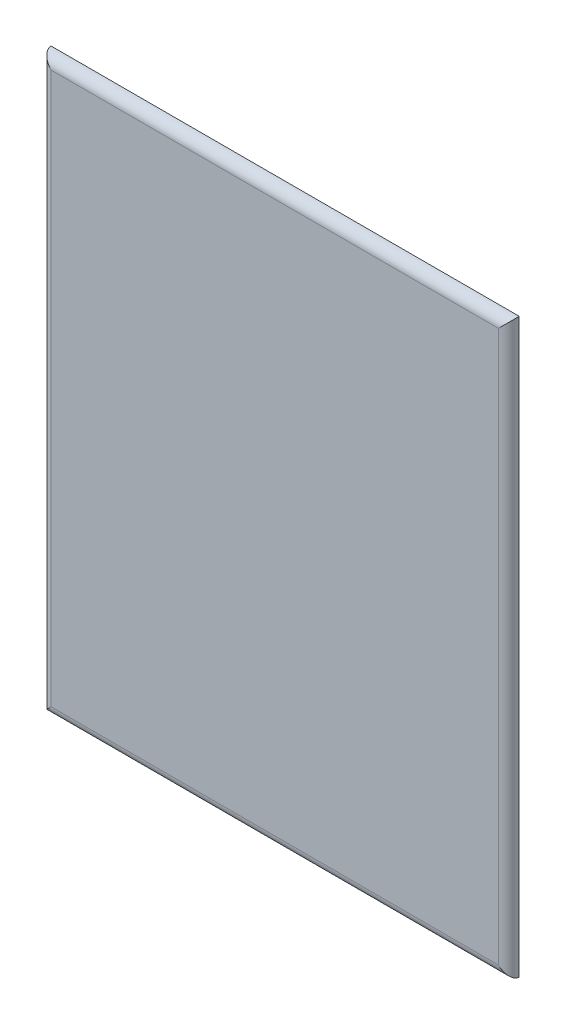
ISO-10303-21;
HEADER;
FILE_DESCRIPTION(('STEP AP214'),'2;1');
FILE_NAME('part.step','',(''),(''),'','','');
FILE_SCHEMA(('AUTOMOTIVE_DESIGN { 1 0 10303 214 1 1 1 1 }'));
ENDSEC;
DATA;
#1=APPLICATION_CONTEXT('core data for automotive mechanical design processes');
#2=APPLICATION_PROTOCOL_DEFINITION('international standard','automotive_design',2000,#1);
#3=PRODUCT_CONTEXT('',#1,'mechanical');
#4=PRODUCT('Part','Part','',(#3));
#5=PRODUCT_RELATED_PRODUCT_CATEGORY('part','',(#4));
#6=PRODUCT_DEFINITION_FORMATION('','',#4);
#7=PRODUCT_DEFINITION_CONTEXT('part definition',#1,'design');
#8=PRODUCT_DEFINITION('design','',#6,#7);
#9=PRODUCT_DEFINITION_SHAPE('','',#8);
#10=(LENGTH_UNIT() NAMED_UNIT(*) SI_UNIT(.MILLI.,.METRE.));
#11=(NAMED_UNIT(*) PLANE_ANGLE_UNIT() SI_UNIT($,.RADIAN.));
#12=(NAMED_UNIT(*) SI_UNIT($,.STERADIAN.) SOLID_ANGLE_UNIT());
#13=UNCERTAINTY_MEASURE_WITH_UNIT(LENGTH_MEASURE(1.E-05),#10,'distance_accuracy_value','');
#14=(GEOMETRIC_REPRESENTATION_CONTEXT(3) GLOBAL_UNCERTAINTY_ASSIGNED_CONTEXT((#13)) GLOBAL_UNIT_ASSIGNED_CONTEXT((#10,
#11,#12)) REPRESENTATION_CONTEXT('',''));
#15=CARTESIAN_POINT('',(0.,0.,0.));
#16=DIRECTION('',(0.,0.,1.));
#17=DIRECTION('',(1.,0.,0.));
#18=AXIS2_PLACEMENT_3D('',#15,#16,#17);
#19=CARTESIAN_POINT('',(0.,0.,3.));
#20=DIRECTION('',(0.,0.,-1.));
#21=DIRECTION('',(-1.,0.,0.));
#22=AXIS2_PLACEMENT_3D('',#19,#20,#21);
#23=PLANE('',#22);
#24=DIRECTION('',(1.,0.,0.));
#25=VECTOR('',#24,1.);
#26=CARTESIAN_POINT('',(0.,-79.5,3.));
#27=LINE('',#26,#25);
#28=CARTESIAN_POINT('',(-64.5,-79.5,3.));
#29=VERTEX_POINT('',#28);
#30=CARTESIAN_POINT('',(64.5,-79.5,3.));
#31=VERTEX_POINT('',#30);
#32=EDGE_CURVE('E229',#29,#31,#27,.T.);
#33=ORIENTED_EDGE('',*,*,#32,.T.);
#34=DIRECTION('',(0.,1.,0.));
#35=VECTOR('',#34,1.);
#36=CARTESIAN_POINT('',(64.5,0.,3.));
#37=LINE('',#36,#35);
#38=CARTESIAN_POINT('',(64.5,79.5,3.));
#39=VERTEX_POINT('',#38);
#40=EDGE_CURVE('E232',#31,#39,#37,.T.);
#41=ORIENTED_EDGE('',*,*,#40,.T.);
#42=DIRECTION('',(-1.,0.,0.));
#43=VECTOR('',#42,1.);
#44=CARTESIAN_POINT('',(0.,79.5,3.));
#45=LINE('',#44,#43);
#46=CARTESIAN_POINT('',(-64.5,79.5,3.));
#47=VERTEX_POINT('',#46);
#48=EDGE_CURVE('E227',#39,#47,#45,.T.);
#49=ORIENTED_EDGE('',*,*,#48,.T.);
#50=DIRECTION('',(0.,-1.,0.));
#51=VECTOR('',#50,1.);
#52=CARTESIAN_POINT('',(-64.5,0.,3.));
#53=LINE('',#52,#51);
#54=EDGE_CURVE('E225',#47,#29,#53,.T.);
#55=ORIENTED_EDGE('',*,*,#54,.T.);
#56=EDGE_LOOP('',(#33,#41,#49,#55));
#57=FACE_BOUND('',#56,.T.);
#58=ADVANCED_FACE('F41',(#57),#23,.F.);
#59=CARTESIAN_POINT('',(0.,0.,0.));
#60=DIRECTION('',(0.,0.,-1.));
#61=DIRECTION('',(-1.,0.,0.));
#62=AXIS2_PLACEMENT_3D('',#59,#60,#61);
#63=PLANE('',#62);
#64=CARTESIAN_POINT('',(14.5,-14.5,0.));
#65=DIRECTION('',(0.,0.,-1.));
#66=DIRECTION('',(1.,0.,0.));
#67=AXIS2_PLACEMENT_3D('',#64,#65,#66);
#68=CIRCLE('',#67,2.);
#69=CARTESIAN_POINT('',(16.5,-14.5,0.));
#70=VERTEX_POINT('',#69);
#71=CARTESIAN_POINT('',(14.5,-16.5,0.));
#72=VERTEX_POINT('',#71);
#73=EDGE_CURVE('E175',#70,#72,#68,.T.);
#74=ORIENTED_EDGE('',*,*,#73,.F.);
#75=DIRECTION('',(0.,-1.,0.));
#76=VECTOR('',#75,1.);
#77=CARTESIAN_POINT('',(16.5,-14.5,0.));
#78=LINE('',#77,#76);
#79=CARTESIAN_POINT('',(16.5,14.5,0.));
#80=VERTEX_POINT('',#79);
#81=EDGE_CURVE('E193',#80,#70,#78,.T.);
#82=ORIENTED_EDGE('',*,*,#81,.F.);
#83=CARTESIAN_POINT('',(14.5,14.5,0.));
#84=DIRECTION('',(0.,0.,-1.));
#85=DIRECTION('',(1.,0.,0.));
#86=AXIS2_PLACEMENT_3D('',#83,#84,#85);
#87=CIRCLE('',#86,2.);
#88=CARTESIAN_POINT('',(14.5,16.5,0.));
#89=VERTEX_POINT('',#88);
#90=EDGE_CURVE('E189',#89,#80,#87,.T.);
#91=ORIENTED_EDGE('',*,*,#90,.F.);
#92=DIRECTION('',(1.,0.,0.));
#93=VECTOR('',#92,1.);
#94=CARTESIAN_POINT('',(14.5,16.5,0.));
#95=LINE('',#94,#93);
#96=CARTESIAN_POINT('',(-14.5,16.5,0.));
#97=VERTEX_POINT('',#96);
#98=EDGE_CURVE('E185',#97,#89,#95,.T.);
#99=ORIENTED_EDGE('',*,*,#98,.F.);
#100=CARTESIAN_POINT('',(-14.5,14.5,0.));
#101=DIRECTION('',(0.,0.,-1.));
#102=DIRECTION('',(1.,0.,0.));
#103=AXIS2_PLACEMENT_3D('',#100,#101,#102);
#104=CIRCLE('',#103,2.);
#105=CARTESIAN_POINT('',(-16.5,14.5,0.));
#106=VERTEX_POINT('',#105);
#107=EDGE_CURVE('E182',#106,#97,#104,.T.);
#108=ORIENTED_EDGE('',*,*,#107,.F.);
#109=DIRECTION('',(0.,1.,0.));
#110=VECTOR('',#109,1.);
#111=CARTESIAN_POINT('',(-16.5,-14.5,0.));
#112=LINE('',#111,#110);
#113=CARTESIAN_POINT('',(-16.5,-14.5,0.));
#114=VERTEX_POINT('',#113);
#115=EDGE_CURVE('E171',#114,#106,#112,.T.);
#116=ORIENTED_EDGE('',*,*,#115,.F.);
#117=CARTESIAN_POINT('',(-14.5,-14.5,0.));
#118=DIRECTION('',(0.,0.,-1.));
#119=DIRECTION('',(-1.,0.,0.));
#120=AXIS2_PLACEMENT_3D('',#117,#118,#119);
#121=CIRCLE('',#120,2.);
#122=CARTESIAN_POINT('',(-14.5,-16.5,0.));
#123=VERTEX_POINT('',#122);
#124=EDGE_CURVE('E152',#123,#114,#121,.T.);
#125=ORIENTED_EDGE('',*,*,#124,.F.);
#126=DIRECTION('',(-1.,0.,0.));
#127=VECTOR('',#126,1.);
#128=CARTESIAN_POINT('',(14.5,-16.5,0.));
#129=LINE('',#128,#127);
#130=EDGE_CURVE('E167',#72,#123,#129,.T.);
#131=ORIENTED_EDGE('',*,*,#130,.F.);
#132=EDGE_LOOP('',(#74,#82,#91,#99,#108,#116,#125,#131));
#133=FACE_BOUND('',#132,.T.);
#134=DIRECTION('',(0.,1.,0.));
#135=VECTOR('',#134,1.);
#136=CARTESIAN_POINT('',(67.5,-82.5,0.));
#137=LINE('',#136,#135);
#138=CARTESIAN_POINT('',(67.5,-82.5,0.));
#139=VERTEX_POINT('',#138);
#140=CARTESIAN_POINT('',(67.5,82.5,0.));
#141=VERTEX_POINT('',#140);
#142=EDGE_CURVE('E212',#139,#141,#137,.T.);
#143=ORIENTED_EDGE('',*,*,#142,.F.);
#144=DIRECTION('',(1.,0.,0.));
#145=VECTOR('',#144,1.);
#146=CARTESIAN_POINT('',(-67.5,-82.5,0.));
#147=LINE('',#146,#145);
#148=CARTESIAN_POINT('',(-67.5,-82.5,0.));
#149=VERTEX_POINT('',#148);
#150=EDGE_CURVE('E222',#149,#139,#147,.T.);
#151=ORIENTED_EDGE('',*,*,#150,.F.);
#152=DIRECTION('',(0.,-1.,0.));
#153=VECTOR('',#152,1.);
#154=CARTESIAN_POINT('',(-67.5,-82.5,0.));
#155=LINE('',#154,#153);
#156=CARTESIAN_POINT('',(-67.5,82.5,0.));
#157=VERTEX_POINT('',#156);
#158=EDGE_CURVE('E219',#157,#149,#155,.T.);
#159=ORIENTED_EDGE('',*,*,#158,.F.);
#160=DIRECTION('',(-1.,0.,0.));
#161=VECTOR('',#160,1.);
#162=CARTESIAN_POINT('',(-67.5,82.5,0.));
#163=LINE('',#162,#161);
#164=EDGE_CURVE('E215',#141,#157,#163,.T.);
#165=ORIENTED_EDGE('',*,*,#164,.F.);
#166=EDGE_LOOP('',(#143,#151,#159,#165));
#167=FACE_BOUND('',#166,.T.);
#168=ADVANCED_FACE('F165',(#133,#167),#63,.T.);
#169=CARTESIAN_POINT('',(0.,79.5,0.));
#170=DIRECTION('',(-1.,0.,0.));
#171=DIRECTION('',(0.,0.,1.));
#172=AXIS2_PLACEMENT_3D('',#169,#170,#171);
#173=CYLINDRICAL_SURFACE('',#172,3.);
#174=CARTESIAN_POINT('',(64.5,79.5,0.));
#175=DIRECTION('',(-0.707106781186547,0.707106781186547,0.));
#176=DIRECTION('',(0.707106781186547,0.707106781186547,0.));
#177=AXIS2_PLACEMENT_3D('',#174,#175,#176);
#178=ELLIPSE('',#177,4.24264068711928,3.);
#179=EDGE_CURVE('E238',#141,#39,#178,.F.);
#180=ORIENTED_EDGE('',*,*,#179,.F.);
#181=ORIENTED_EDGE('',*,*,#164,.T.);
#182=CARTESIAN_POINT('',(-64.5,79.5,0.));
#183=DIRECTION('',(-0.707106781186547,-0.707106781186547,0.));
#184=DIRECTION('',(0.707106781186547,-0.707106781186547,0.));
#185=AXIS2_PLACEMENT_3D('',#182,#183,#184);
#186=ELLIPSE('',#185,4.24264068711928,3.);
#187=EDGE_CURVE('E216',#47,#157,#186,.T.);
#188=ORIENTED_EDGE('',*,*,#187,.F.);
#189=ORIENTED_EDGE('',*,*,#48,.F.);
#190=EDGE_LOOP('',(#180,#181,#188,#189));
#191=FACE_BOUND('',#190,.T.);
#192=ADVANCED_FACE('F344',(#191),#173,.T.);
#193=CARTESIAN_POINT('',(-64.5,0.,0.));
#194=DIRECTION('',(0.,-1.,0.));
#195=DIRECTION('',(0.,0.,-1.));
#196=AXIS2_PLACEMENT_3D('',#193,#194,#195);
#197=CYLINDRICAL_SURFACE('',#196,3.);
#198=ORIENTED_EDGE('',*,*,#187,.T.);
#199=ORIENTED_EDGE('',*,*,#158,.T.);
#200=CARTESIAN_POINT('',(-64.5,-79.5,0.));
#201=DIRECTION('',(0.707106781186547,-0.707106781186547,0.));
#202=DIRECTION('',(-0.707106781186547,-0.707106781186547,0.));
#203=AXIS2_PLACEMENT_3D('',#200,#201,#202);
#204=ELLIPSE('',#203,4.24264068711928,3.);
#205=EDGE_CURVE('E236',#29,#149,#204,.T.);
#206=ORIENTED_EDGE('',*,*,#205,.F.);
#207=ORIENTED_EDGE('',*,*,#54,.F.);
#208=EDGE_LOOP('',(#198,#199,#206,#207));
#209=FACE_BOUND('',#208,.T.);
#210=ADVANCED_FACE('F357',(#209),#197,.T.);
#211=CARTESIAN_POINT('',(64.5,0.,0.));
#212=DIRECTION('',(0.,1.,0.));
#213=DIRECTION('',(0.,0.,1.));
#214=AXIS2_PLACEMENT_3D('',#211,#212,#213);
#215=CYLINDRICAL_SURFACE('',#214,3.);
#216=ORIENTED_EDGE('',*,*,#179,.T.);
#217=ORIENTED_EDGE('',*,*,#40,.F.);
#218=CARTESIAN_POINT('',(64.5,-79.5,0.));
#219=DIRECTION('',(0.707106781186547,0.707106781186547,0.));
#220=DIRECTION('',(-0.707106781186547,0.707106781186547,0.));
#221=AXIS2_PLACEMENT_3D('',#218,#219,#220);
#222=ELLIPSE('',#221,4.24264068711928,3.);
#223=EDGE_CURVE('E211',#139,#31,#222,.F.);
#224=ORIENTED_EDGE('',*,*,#223,.F.);
#225=ORIENTED_EDGE('',*,*,#142,.T.);
#226=EDGE_LOOP('',(#216,#217,#224,#225));
#227=FACE_BOUND('',#226,.T.);
#228=ADVANCED_FACE('F353',(#227),#215,.T.);
#229=CARTESIAN_POINT('',(0.,-79.5,0.));
#230=DIRECTION('',(1.,0.,0.));
#231=DIRECTION('',(0.,0.,-1.));
#232=AXIS2_PLACEMENT_3D('',#229,#230,#231);
#233=CYLINDRICAL_SURFACE('',#232,3.);
#234=ORIENTED_EDGE('',*,*,#205,.T.);
#235=ORIENTED_EDGE('',*,*,#150,.T.);
#236=ORIENTED_EDGE('',*,*,#223,.T.);
#237=ORIENTED_EDGE('',*,*,#32,.F.);
#238=EDGE_LOOP('',(#234,#235,#236,#237));
#239=FACE_BOUND('',#238,.T.);
#240=ADVANCED_FACE('F350',(#239),#233,.T.);
#241=CARTESIAN_POINT('',(14.5,-14.5,-5.));
#242=DIRECTION('',(0.,0.,1.));
#243=DIRECTION('',(1.,0.,0.));
#244=AXIS2_PLACEMENT_3D('',#241,#242,#243);
#245=CYLINDRICAL_SURFACE('',#244,2.);
#246=DIRECTION('',(0.,0.,1.));
#247=VECTOR('',#246,1.);
#248=CARTESIAN_POINT('',(14.5,-16.5,-5.));
#249=LINE('',#248,#247);
#250=CARTESIAN_POINT('',(14.5,-16.5,-3.));
#251=VERTEX_POINT('',#250);
#252=EDGE_CURVE('E158',#251,#72,#249,.T.);
#253=ORIENTED_EDGE('',*,*,#252,.F.);
#254=CARTESIAN_POINT('',(14.5,-14.5,-3.));
#255=DIRECTION('',(0.,0.,1.));
#256=DIRECTION('',(1.,0.,0.));
#257=AXIS2_PLACEMENT_3D('',#254,#255,#256);
#258=CIRCLE('',#257,2.);
#259=CARTESIAN_POINT('',(16.5,-14.5,-3.));
#260=VERTEX_POINT('',#259);
#261=EDGE_CURVE('E259',#251,#260,#258,.T.);
#262=ORIENTED_EDGE('',*,*,#261,.T.);
#263=DIRECTION('',(0.,0.,1.));
#264=VECTOR('',#263,1.);
#265=CARTESIAN_POINT('',(16.5,-14.5,-5.));
#266=LINE('',#265,#264);
#267=EDGE_CURVE('E197',#260,#70,#266,.T.);
#268=ORIENTED_EDGE('',*,*,#267,.T.);
#269=ORIENTED_EDGE('',*,*,#73,.T.);
#270=EDGE_LOOP('',(#253,#262,#268,#269));
#271=FACE_BOUND('',#270,.T.);
#272=ADVANCED_FACE('F347',(#271),#245,.T.);
#273=CARTESIAN_POINT('',(14.5,-16.5,-5.));
#274=DIRECTION('',(0.,1.,0.));
#275=DIRECTION('',(0.,0.,1.));
#276=AXIS2_PLACEMENT_3D('',#273,#274,#275);
#277=PLANE('',#276);
#278=DIRECTION('',(0.,0.,1.));
#279=VECTOR('',#278,1.);
#280=CARTESIAN_POINT('',(-14.5,-16.5,-5.));
#281=LINE('',#280,#279);
#282=CARTESIAN_POINT('',(-14.5,-16.5,-3.));
#283=VERTEX_POINT('',#282);
#284=EDGE_CURVE('E148',#283,#123,#281,.T.);
#285=ORIENTED_EDGE('',*,*,#284,.F.);
#286=DIRECTION('',(-1.,0.,0.));
#287=VECTOR('',#286,1.);
#288=CARTESIAN_POINT('',(14.5,-16.5,-3.));
#289=LINE('',#288,#287);
#290=EDGE_CURVE('E257',#283,#251,#289,.F.);
#291=ORIENTED_EDGE('',*,*,#290,.T.);
#292=ORIENTED_EDGE('',*,*,#252,.T.);
#293=ORIENTED_EDGE('',*,*,#130,.T.);
#294=EDGE_LOOP('',(#285,#291,#292,#293));
#295=FACE_BOUND('',#294,.T.);
#296=ADVANCED_FACE('F173',(#295),#277,.F.);
#297=CARTESIAN_POINT('',(-14.5,-14.5,-5.));
#298=DIRECTION('',(0.,0.,1.));
#299=DIRECTION('',(1.,0.,0.));
#300=AXIS2_PLACEMENT_3D('',#297,#298,#299);
#301=CYLINDRICAL_SURFACE('',#300,2.);
#302=DIRECTION('',(0.,0.,1.));
#303=VECTOR('',#302,1.);
#304=CARTESIAN_POINT('',(-16.5,-14.5,-5.));
#305=LINE('',#304,#303);
#306=CARTESIAN_POINT('',(-16.5,-14.5,-3.));
#307=VERTEX_POINT('',#306);
#308=EDGE_CURVE('E159',#307,#114,#305,.T.);
#309=ORIENTED_EDGE('',*,*,#308,.F.);
#310=CARTESIAN_POINT('',(-14.5,-14.5,-3.));
#311=DIRECTION('',(0.,0.,1.));
#312=DIRECTION('',(1.,0.,0.));
#313=AXIS2_PLACEMENT_3D('',#310,#311,#312);
#314=CIRCLE('',#313,2.);
#315=EDGE_CURVE('E154',#307,#283,#314,.T.);
#316=ORIENTED_EDGE('',*,*,#315,.T.);
#317=ORIENTED_EDGE('',*,*,#284,.T.);
#318=ORIENTED_EDGE('',*,*,#124,.T.);
#319=EDGE_LOOP('',(#309,#316,#317,#318));
#320=FACE_BOUND('',#319,.T.);
#321=ADVANCED_FACE('F151',(#320),#301,.T.);
#322=CARTESIAN_POINT('',(-16.5,-14.5,-5.));
#323=DIRECTION('',(1.,0.,0.));
#324=DIRECTION('',(0.,0.,-1.));
#325=AXIS2_PLACEMENT_3D('',#322,#323,#324);
#326=PLANE('',#325);
#327=CARTESIAN_POINT('',(-16.5,0.,-1.5));
#328=DIRECTION('',(1.,0.,0.));
#329=DIRECTION('',(0.,0.,-1.));
#330=AXIS2_PLACEMENT_3D('',#327,#328,#329);
#331=CIRCLE('',#330,0.75);
#332=CARTESIAN_POINT('',(-16.5,0.,-2.25));
#333=VERTEX_POINT('',#332);
#334=EDGE_CURVE('E11',#333,#333,#331,.F.);
#335=ORIENTED_EDGE('',*,*,#334,.F.);
#336=EDGE_LOOP('',(#335));
#337=FACE_BOUND('',#336,.T.);
#338=DIRECTION('',(0.,0.,1.));
#339=VECTOR('',#338,1.);
#340=CARTESIAN_POINT('',(-16.5,14.5,-5.));
#341=LINE('',#340,#339);
#342=CARTESIAN_POINT('',(-16.5,14.5,-3.));
#343=VERTEX_POINT('',#342);
#344=EDGE_CURVE('E207',#343,#106,#341,.T.);
#345=ORIENTED_EDGE('',*,*,#344,.F.);
#346=DIRECTION('',(0.,1.,0.));
#347=VECTOR('',#346,1.);
#348=CARTESIAN_POINT('',(-16.5,-14.5,-3.));
#349=LINE('',#348,#347);
#350=EDGE_CURVE('E253',#343,#307,#349,.F.);
#351=ORIENTED_EDGE('',*,*,#350,.T.);
#352=ORIENTED_EDGE('',*,*,#308,.T.);
#353=ORIENTED_EDGE('',*,*,#115,.T.);
#354=EDGE_LOOP('',(#345,#351,#352,#353));
#355=FACE_BOUND('',#354,.T.);
#356=ADVANCED_FACE('F327',(#337,#355),#326,.F.);
#357=CARTESIAN_POINT('',(-14.5,14.5,-5.));
#358=DIRECTION('',(0.,0.,1.));
#359=DIRECTION('',(1.,0.,0.));
#360=AXIS2_PLACEMENT_3D('',#357,#358,#359);
#361=CYLINDRICAL_SURFACE('',#360,2.);
#362=DIRECTION('',(0.,0.,1.));
#363=VECTOR('',#362,1.);
#364=CARTESIAN_POINT('',(-14.5,16.5,-5.));
#365=LINE('',#364,#363);
#366=CARTESIAN_POINT('',(-14.5,16.5,-3.));
#367=VERTEX_POINT('',#366);
#368=EDGE_CURVE('E205',#367,#97,#365,.T.);
#369=ORIENTED_EDGE('',*,*,#368,.F.);
#370=CARTESIAN_POINT('',(-14.5,14.5,-3.));
#371=DIRECTION('',(0.,0.,1.));
#372=DIRECTION('',(1.,0.,0.));
#373=AXIS2_PLACEMENT_3D('',#370,#371,#372);
#374=CIRCLE('',#373,2.);
#375=EDGE_CURVE('E49',#367,#343,#374,.T.);
#376=ORIENTED_EDGE('',*,*,#375,.T.);
#377=ORIENTED_EDGE('',*,*,#344,.T.);
#378=ORIENTED_EDGE('',*,*,#107,.T.);
#379=EDGE_LOOP('',(#369,#376,#377,#378));
#380=FACE_BOUND('',#379,.T.);
#381=ADVANCED_FACE('F312',(#380),#361,.T.);
#382=CARTESIAN_POINT('',(14.5,16.5,-5.));
#383=DIRECTION('',(0.,-1.,0.));
#384=DIRECTION('',(0.,0.,-1.));
#385=AXIS2_PLACEMENT_3D('',#382,#383,#384);
#386=PLANE('',#385);
#387=DIRECTION('',(0.,0.,1.));
#388=VECTOR('',#387,1.);
#389=CARTESIAN_POINT('',(14.5,16.5,-5.));
#390=LINE('',#389,#388);
#391=CARTESIAN_POINT('',(14.5,16.5,-3.));
#392=VERTEX_POINT('',#391);
#393=EDGE_CURVE('E202',#392,#89,#390,.T.);
#394=ORIENTED_EDGE('',*,*,#393,.F.);
#395=DIRECTION('',(1.,0.,0.));
#396=VECTOR('',#395,1.);
#397=CARTESIAN_POINT('',(14.5,16.5,-3.));
#398=LINE('',#397,#396);
#399=EDGE_CURVE('E56',#392,#367,#398,.F.);
#400=ORIENTED_EDGE('',*,*,#399,.T.);
#401=ORIENTED_EDGE('',*,*,#368,.T.);
#402=ORIENTED_EDGE('',*,*,#98,.T.);
#403=EDGE_LOOP('',(#394,#400,#401,#402));
#404=FACE_BOUND('',#403,.T.);
#405=ADVANCED_FACE('F308',(#404),#386,.F.);
#406=CARTESIAN_POINT('',(14.5,14.5,-5.));
#407=DIRECTION('',(0.,0.,1.));
#408=DIRECTION('',(1.,0.,0.));
#409=AXIS2_PLACEMENT_3D('',#406,#407,#408);
#410=CYLINDRICAL_SURFACE('',#409,2.);
#411=DIRECTION('',(0.,0.,1.));
#412=VECTOR('',#411,1.);
#413=CARTESIAN_POINT('',(16.5,14.5,-5.));
#414=LINE('',#413,#412);
#415=CARTESIAN_POINT('',(16.5,14.5,-3.));
#416=VERTEX_POINT('',#415);
#417=EDGE_CURVE('E199',#416,#80,#414,.T.);
#418=ORIENTED_EDGE('',*,*,#417,.F.);
#419=CARTESIAN_POINT('',(14.5,14.5,-3.));
#420=DIRECTION('',(0.,0.,1.));
#421=DIRECTION('',(1.,0.,0.));
#422=AXIS2_PLACEMENT_3D('',#419,#420,#421);
#423=CIRCLE('',#422,2.);
#424=EDGE_CURVE('E67',#416,#392,#423,.T.);
#425=ORIENTED_EDGE('',*,*,#424,.T.);
#426=ORIENTED_EDGE('',*,*,#393,.T.);
#427=ORIENTED_EDGE('',*,*,#90,.T.);
#428=EDGE_LOOP('',(#418,#425,#426,#427));
#429=FACE_BOUND('',#428,.T.);
#430=ADVANCED_FACE('F305',(#429),#410,.T.);
#431=CARTESIAN_POINT('',(16.5,-14.5,-5.));
#432=DIRECTION('',(-1.,0.,0.));
#433=DIRECTION('',(0.,0.,1.));
#434=AXIS2_PLACEMENT_3D('',#431,#432,#433);
#435=PLANE('',#434);
#436=ORIENTED_EDGE('',*,*,#267,.F.);
#437=DIRECTION('',(0.,-1.,0.));
#438=VECTOR('',#437,1.);
#439=CARTESIAN_POINT('',(16.5,-14.5,-3.));
#440=LINE('',#439,#438);
#441=EDGE_CURVE('E261',#260,#416,#440,.F.);
#442=ORIENTED_EDGE('',*,*,#441,.T.);
#443=ORIENTED_EDGE('',*,*,#417,.T.);
#444=ORIENTED_EDGE('',*,*,#81,.T.);
#445=EDGE_LOOP('',(#436,#442,#443,#444));
#446=FACE_BOUND('',#445,.T.);
#447=ADVANCED_FACE('F303',(#446),#435,.F.);
#448=CARTESIAN_POINT('',(14.5,-14.5,-5.));
#449=DIRECTION('',(0.,0.,1.));
#450=DIRECTION('',(1.,0.,0.));
#451=AXIS2_PLACEMENT_3D('',#448,#449,#450);
#452=PLANE('',#451);
#453=DIRECTION('',(-1.,0.,0.));
#454=VECTOR('',#453,1.);
#455=CARTESIAN_POINT('',(14.5,-14.5,-5.));
#456=LINE('',#455,#454);
#457=CARTESIAN_POINT('',(14.5,-14.5,-5.));
#458=VERTEX_POINT('',#457);
#459=CARTESIAN_POINT('',(-14.5,-14.5,-5.));
#460=VERTEX_POINT('',#459);
#461=EDGE_CURVE('E248',#458,#460,#456,.T.);
#462=ORIENTED_EDGE('',*,*,#461,.T.);
#463=DIRECTION('',(0.,1.,0.));
#464=VECTOR('',#463,1.);
#465=CARTESIAN_POINT('',(-14.5,-14.5,-5.));
#466=LINE('',#465,#464);
#467=CARTESIAN_POINT('',(-14.5,14.5,-5.));
#468=VERTEX_POINT('',#467);
#469=EDGE_CURVE('E250',#460,#468,#466,.T.);
#470=ORIENTED_EDGE('',*,*,#469,.T.);
#471=DIRECTION('',(1.,0.,0.));
#472=VECTOR('',#471,1.);
#473=CARTESIAN_POINT('',(14.5,14.5,-5.));
#474=LINE('',#473,#472);
#475=CARTESIAN_POINT('',(14.5,14.5,-5.));
#476=VERTEX_POINT('',#475);
#477=EDGE_CURVE('E234',#468,#476,#474,.T.);
#478=ORIENTED_EDGE('',*,*,#477,.T.);
#479=DIRECTION('',(0.,-1.,0.));
#480=VECTOR('',#479,1.);
#481=CARTESIAN_POINT('',(14.5,-14.5,-5.));
#482=LINE('',#481,#480);
#483=EDGE_CURVE('E245',#476,#458,#482,.T.);
#484=ORIENTED_EDGE('',*,*,#483,.T.);
#485=EDGE_LOOP('',(#462,#470,#478,#484));
#486=FACE_BOUND('',#485,.T.);
#487=ADVANCED_FACE('F387',(#486),#452,.F.);
#488=CARTESIAN_POINT('',(14.5,-14.5,-3.));
#489=DIRECTION('',(0.,-1.,0.));
#490=DIRECTION('',(0.,0.,-1.));
#491=AXIS2_PLACEMENT_3D('',#488,#489,#490);
#492=CYLINDRICAL_SURFACE('',#491,2.);
#493=CARTESIAN_POINT('',(14.5,14.5,-3.));
#494=DIRECTION('',(0.,1.,0.));
#495=DIRECTION('',(0.,0.,1.));
#496=AXIS2_PLACEMENT_3D('',#493,#494,#495);
#497=CIRCLE('',#496,2.);
#498=EDGE_CURVE('E287',#416,#476,#497,.T.);
#499=ORIENTED_EDGE('',*,*,#498,.F.);
#500=ORIENTED_EDGE('',*,*,#441,.F.);
#501=CARTESIAN_POINT('',(14.5,-14.5,-3.));
#502=DIRECTION('',(0.,-1.,0.));
#503=DIRECTION('',(1.,0.,0.));
#504=AXIS2_PLACEMENT_3D('',#501,#502,#503);
#505=CIRCLE('',#504,2.);
#506=EDGE_CURVE('E177',#458,#260,#505,.T.);
#507=ORIENTED_EDGE('',*,*,#506,.F.);
#508=ORIENTED_EDGE('',*,*,#483,.F.);
#509=EDGE_LOOP('',(#499,#500,#507,#508));
#510=FACE_BOUND('',#509,.T.);
#511=ADVANCED_FACE('F43',(#510),#492,.T.);
#512=CARTESIAN_POINT('',(14.5,-14.5,-3.));
#513=DIRECTION('',(0.,0.,1.));
#514=DIRECTION('',(1.,0.,0.));
#515=AXIS2_PLACEMENT_3D('',#512,#513,#514);
#516=SPHERICAL_SURFACE('',#515,2.);
#517=ORIENTED_EDGE('',*,*,#506,.T.);
#518=ORIENTED_EDGE('',*,*,#261,.F.);
#519=CARTESIAN_POINT('',(14.5,-14.5,-3.));
#520=DIRECTION('',(-1.,0.,0.));
#521=DIRECTION('',(0.,-1.,0.));
#522=AXIS2_PLACEMENT_3D('',#519,#520,#521);
#523=CIRCLE('',#522,2.);
#524=EDGE_CURVE('E284',#458,#251,#523,.T.);
#525=ORIENTED_EDGE('',*,*,#524,.F.);
#526=EDGE_LOOP('',(#517,#518,#525));
#527=FACE_BOUND('',#526,.T.);
#528=ADVANCED_FACE('F295',(#527),#516,.T.);
#529=CARTESIAN_POINT('',(14.5,14.5,-3.));
#530=DIRECTION('',(0.,0.,1.));
#531=DIRECTION('',(1.,0.,0.));
#532=AXIS2_PLACEMENT_3D('',#529,#530,#531);
#533=SPHERICAL_SURFACE('',#532,2.);
#534=ORIENTED_EDGE('',*,*,#424,.F.);
#535=ORIENTED_EDGE('',*,*,#498,.T.);
#536=CARTESIAN_POINT('',(14.5,14.5,-3.));
#537=DIRECTION('',(-1.,0.,0.));
#538=DIRECTION('',(0.,-1.,0.));
#539=AXIS2_PLACEMENT_3D('',#536,#537,#538);
#540=CIRCLE('',#539,2.);
#541=EDGE_CURVE('E280',#392,#476,#540,.T.);
#542=ORIENTED_EDGE('',*,*,#541,.F.);
#543=EDGE_LOOP('',(#534,#535,#542));
#544=FACE_BOUND('',#543,.T.);
#545=ADVANCED_FACE('F379',(#544),#533,.T.);
#546=CARTESIAN_POINT('',(14.5,-14.5,-3.));
#547=DIRECTION('',(-1.,0.,0.));
#548=DIRECTION('',(0.,0.,1.));
#549=AXIS2_PLACEMENT_3D('',#546,#547,#548);
#550=CYLINDRICAL_SURFACE('',#549,2.);
#551=ORIENTED_EDGE('',*,*,#524,.T.);
#552=ORIENTED_EDGE('',*,*,#290,.F.);
#553=CARTESIAN_POINT('',(-14.5,-14.5,-3.));
#554=DIRECTION('',(-1.,0.,0.));
#555=DIRECTION('',(0.,-1.,0.));
#556=AXIS2_PLACEMENT_3D('',#553,#554,#555);
#557=CIRCLE('',#556,2.);
#558=EDGE_CURVE('E277',#460,#283,#557,.T.);
#559=ORIENTED_EDGE('',*,*,#558,.F.);
#560=ORIENTED_EDGE('',*,*,#461,.F.);
#561=EDGE_LOOP('',(#551,#552,#559,#560));
#562=FACE_BOUND('',#561,.T.);
#563=ADVANCED_FACE('F376',(#562),#550,.T.);
#564=CARTESIAN_POINT('',(14.5,14.5,-3.));
#565=DIRECTION('',(1.,0.,0.));
#566=DIRECTION('',(0.,0.,-1.));
#567=AXIS2_PLACEMENT_3D('',#564,#565,#566);
#568=CYLINDRICAL_SURFACE('',#567,2.);
#569=ORIENTED_EDGE('',*,*,#541,.T.);
#570=ORIENTED_EDGE('',*,*,#477,.F.);
#571=CARTESIAN_POINT('',(-14.5,14.5,-3.));
#572=DIRECTION('',(-1.,0.,0.));
#573=DIRECTION('',(0.,0.,1.));
#574=AXIS2_PLACEMENT_3D('',#571,#572,#573);
#575=CIRCLE('',#574,2.);
#576=EDGE_CURVE('E274',#367,#468,#575,.T.);
#577=ORIENTED_EDGE('',*,*,#576,.F.);
#578=ORIENTED_EDGE('',*,*,#399,.F.);
#579=EDGE_LOOP('',(#569,#570,#577,#578));
#580=FACE_BOUND('',#579,.T.);
#581=ADVANCED_FACE('F317',(#580),#568,.T.);
#582=CARTESIAN_POINT('',(-14.5,-14.5,-3.));
#583=DIRECTION('',(0.,0.,1.));
#584=DIRECTION('',(1.,0.,0.));
#585=AXIS2_PLACEMENT_3D('',#582,#583,#584);
#586=SPHERICAL_SURFACE('',#585,2.);
#587=ORIENTED_EDGE('',*,*,#558,.T.);
#588=ORIENTED_EDGE('',*,*,#315,.F.);
#589=CARTESIAN_POINT('',(-14.5,-14.5,-3.));
#590=DIRECTION('',(0.,1.,0.));
#591=DIRECTION('',(0.,0.,1.));
#592=AXIS2_PLACEMENT_3D('',#589,#590,#591);
#593=CIRCLE('',#592,2.);
#594=EDGE_CURVE('E271',#460,#307,#593,.T.);
#595=ORIENTED_EDGE('',*,*,#594,.F.);
#596=EDGE_LOOP('',(#587,#588,#595));
#597=FACE_BOUND('',#596,.T.);
#598=ADVANCED_FACE('F370',(#597),#586,.T.);
#599=CARTESIAN_POINT('',(-14.5,14.5,-3.));
#600=DIRECTION('',(0.,0.,1.));
#601=DIRECTION('',(1.,0.,0.));
#602=AXIS2_PLACEMENT_3D('',#599,#600,#601);
#603=SPHERICAL_SURFACE('',#602,2.);
#604=ORIENTED_EDGE('',*,*,#375,.F.);
#605=ORIENTED_EDGE('',*,*,#576,.T.);
#606=CARTESIAN_POINT('',(-14.5,14.5,-3.));
#607=DIRECTION('',(0.,-1.,0.));
#608=DIRECTION('',(1.,0.,0.));
#609=AXIS2_PLACEMENT_3D('',#606,#607,#608);
#610=CIRCLE('',#609,2.);
#611=EDGE_CURVE('E269',#343,#468,#610,.T.);
#612=ORIENTED_EDGE('',*,*,#611,.F.);
#613=EDGE_LOOP('',(#604,#605,#612));
#614=FACE_BOUND('',#613,.T.);
#615=ADVANCED_FACE('F320',(#614),#603,.T.);
#616=CARTESIAN_POINT('',(-14.5,-14.5,-3.));
#617=DIRECTION('',(0.,1.,0.));
#618=DIRECTION('',(0.,0.,1.));
#619=AXIS2_PLACEMENT_3D('',#616,#617,#618);
#620=CYLINDRICAL_SURFACE('',#619,2.);
#621=ORIENTED_EDGE('',*,*,#594,.T.);
#622=ORIENTED_EDGE('',*,*,#350,.F.);
#623=ORIENTED_EDGE('',*,*,#611,.T.);
#624=ORIENTED_EDGE('',*,*,#469,.F.);
#625=EDGE_LOOP('',(#621,#622,#623,#624));
#626=FACE_BOUND('',#625,.T.);
#627=ADVANCED_FACE('F324',(#626),#620,.T.);
#628=CARTESIAN_POINT('',(-21.5,0.,-1.5));
#629=DIRECTION('',(1.,0.,0.));
#630=DIRECTION('',(0.,0.,-1.));
#631=AXIS2_PLACEMENT_3D('',#628,#629,#630);
#632=CYLINDRICAL_SURFACE('',#631,0.75);
#633=CARTESIAN_POINT('',(-21.5,0.,-1.5));
#634=DIRECTION('',(-1.,0.,0.));
#635=DIRECTION('',(0.,0.,1.));
#636=AXIS2_PLACEMENT_3D('',#633,#634,#635);
#637=CIRCLE('',#636,0.75);
#638=CARTESIAN_POINT('',(-21.5,0.,-0.75));
#639=VERTEX_POINT('',#638);
#640=EDGE_CURVE('E272',#639,#639,#637,.T.);
#641=ORIENTED_EDGE('',*,*,#640,.F.);
#642=EDGE_LOOP('',(#641));
#643=FACE_BOUND('',#642,.T.);
#644=ORIENTED_EDGE('',*,*,#334,.T.);
#645=EDGE_LOOP('',(#644));
#646=FACE_BOUND('',#645,.T.);
#647=ADVANCED_FACE('F367',(#643,#646),#632,.T.);
#648=CARTESIAN_POINT('',(-21.5,0.,-1.5));
#649=DIRECTION('',(-1.,0.,0.));
#650=DIRECTION('',(0.,0.,1.));
#651=AXIS2_PLACEMENT_3D('',#648,#649,#650);
#652=PLANE('',#651);
#653=ORIENTED_EDGE('',*,*,#640,.T.);
#654=EDGE_LOOP('',(#653));
#655=FACE_BOUND('',#654,.T.);
#656=ADVANCED_FACE('F485',(#655),#652,.T.);
#657=CLOSED_SHELL('',(#58,#168,#192,#210,#228,#240,#272,#296,#321,#356,#381,#405,#430,#447,#487,
#511,#528,#545,#563,#581,#598,#615,#627,#647,#656));
#658=MANIFOLD_SOLID_BREP('B2',#657);
#659=ADVANCED_BREP_SHAPE_REPRESENTATION('',(#18,#658),#14);
#660=SHAPE_DEFINITION_REPRESENTATION(#9,#659);
ENDSEC;
END-ISO-10303-21;
